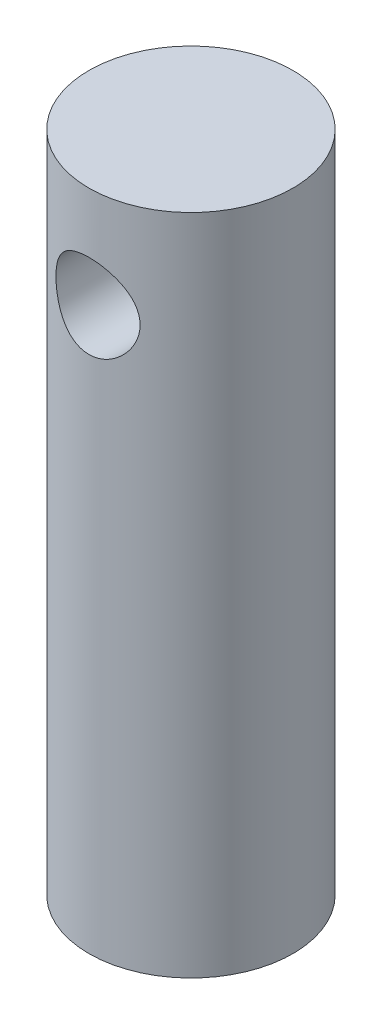
ISO-10303-21;
HEADER;
FILE_DESCRIPTION(('STEP AP214'),'2;1');
FILE_NAME('part.step','',(''),(''),'','','');
FILE_SCHEMA(('AUTOMOTIVE_DESIGN { 1 0 10303 214 1 1 1 1 }'));
ENDSEC;
DATA;
#1=APPLICATION_CONTEXT('core data for automotive mechanical design processes');
#2=APPLICATION_PROTOCOL_DEFINITION('international standard','automotive_design',2000,#1);
#3=PRODUCT_CONTEXT('',#1,'mechanical');
#4=PRODUCT('Part','Part','',(#3));
#5=PRODUCT_RELATED_PRODUCT_CATEGORY('part','',(#4));
#6=PRODUCT_DEFINITION_FORMATION('','',#4);
#7=PRODUCT_DEFINITION_CONTEXT('part definition',#1,'design');
#8=PRODUCT_DEFINITION('design','',#6,#7);
#9=PRODUCT_DEFINITION_SHAPE('','',#8);
#10=(LENGTH_UNIT() NAMED_UNIT(*) SI_UNIT(.MILLI.,.METRE.));
#11=(NAMED_UNIT(*) PLANE_ANGLE_UNIT() SI_UNIT($,.RADIAN.));
#12=(NAMED_UNIT(*) SI_UNIT($,.STERADIAN.) SOLID_ANGLE_UNIT());
#13=UNCERTAINTY_MEASURE_WITH_UNIT(LENGTH_MEASURE(1.E-05),#10,'distance_accuracy_value','');
#14=(GEOMETRIC_REPRESENTATION_CONTEXT(3) GLOBAL_UNCERTAINTY_ASSIGNED_CONTEXT((#13)) GLOBAL_UNIT_ASSIGNED_CONTEXT((#10,
#11,#12)) REPRESENTATION_CONTEXT('',''));
#15=CARTESIAN_POINT('',(0.,0.,0.));
#16=DIRECTION('',(0.,0.,1.));
#17=DIRECTION('',(1.,0.,0.));
#18=AXIS2_PLACEMENT_3D('',#15,#16,#17);
#19=CARTESIAN_POINT('',(0.,26.,0.));
#20=DIRECTION('',(0.,-1.,0.));
#21=DIRECTION('',(0.,0.,-1.));
#22=AXIS2_PLACEMENT_3D('',#19,#20,#21);
#23=CYLINDRICAL_SURFACE('',#22,4.);
#24=CARTESIAN_POINT('',(0.,23.65,-4.));
#25=CARTESIAN_POINT('',(-0.088459678363279,23.6499907827934,-3.99999309817074));
#26=CARTESIAN_POINT('',(-0.177062252057583,23.6428439856567,-3.99703145792172));
#27=CARTESIAN_POINT('',(-0.351759669836409,23.6145088580631,-3.9854711320255));
#28=CARTESIAN_POINT('',(-0.437847271996961,23.5932834889757,-3.97685757767606));
#29=CARTESIAN_POINT('',(-0.604702496902741,23.5377051877981,-3.95491965529936));
#30=CARTESIAN_POINT('',(-0.685486934491195,23.5033963566465,-3.94161112398211));
#31=CARTESIAN_POINT('',(-0.840076633223486,23.4228052421506,-3.91158286286531));
#32=CARTESIAN_POINT('',(-0.913884076117565,23.3765267188298,-3.89486420463244));
#33=CARTESIAN_POINT('',(-1.05618769598525,23.270893245356,-3.85876900012149));
#34=CARTESIAN_POINT('',(-1.12429373957476,23.211042329751,-3.83930654387258));
#35=CARTESIAN_POINT('',(-1.24983574384757,23.081011160341,-3.80029483347098));
#36=CARTESIAN_POINT('',(-1.30726618926957,23.0108256007882,-3.78074553976622));
#37=CARTESIAN_POINT('',(-1.41254826809049,22.8580317511283,-3.74272551686067));
#38=CARTESIAN_POINT('',(-1.45980781790561,22.7749888846935,-3.72435159658093));
#39=CARTESIAN_POINT('',(-1.53951358199407,22.6012636907098,-3.69212136090386));
#40=CARTESIAN_POINT('',(-1.57196727712791,22.510585248637,-3.67826276509115));
#41=CARTESIAN_POINT('',(-1.61953738222492,22.3286520029982,-3.65756021871623));
#42=CARTESIAN_POINT('',(-1.63540371417154,22.2376289278569,-3.65041449103236));
#43=CARTESIAN_POINT('',(-1.65168918120803,22.0539534926347,-3.64307714795703));
#44=CARTESIAN_POINT('',(-1.65211659474,21.9613020323707,-3.64288180572738));
#45=CARTESIAN_POINT('',(-1.6380778077983,21.7844011133813,-3.64921138579604));
#46=CARTESIAN_POINT('',(-1.62472398487459,21.7000418412508,-3.6552343974104));
#47=CARTESIAN_POINT('',(-1.58536484231198,21.5348897156188,-3.67247532251837));
#48=CARTESIAN_POINT('',(-1.55935715587185,21.4540975323967,-3.68369420783859));
#49=CARTESIAN_POINT('',(-1.49492412942489,21.2963548912414,-3.71031458481431));
#50=CARTESIAN_POINT('',(-1.45624866973017,21.2195212621917,-3.72579923184191));
#51=CARTESIAN_POINT('',(-1.36775445443625,21.07313976754,-3.75918616236907));
#52=CARTESIAN_POINT('',(-1.31793135478159,21.0035947577509,-3.77708938726885));
#53=CARTESIAN_POINT('',(-1.20371911924869,20.8677135922122,-3.81509742396095));
#54=CARTESIAN_POINT('',(-1.13846630094389,20.8021180422967,-3.8352618825369));
#55=CARTESIAN_POINT('',(-0.997682554866219,20.6825553255586,-3.87426910607353));
#56=CARTESIAN_POINT('',(-0.922149319847436,20.6285907761392,-3.8931115728953));
#57=CARTESIAN_POINT('',(-0.760736369737327,20.532765226415,-3.92787932271737));
#58=CARTESIAN_POINT('',(-0.674664094072239,20.4911997168058,-3.94373050716791));
#59=CARTESIAN_POINT('',(-0.49592825355298,20.4233969758911,-3.97016319816605));
#60=CARTESIAN_POINT('',(-0.403268287372388,20.3971514467888,-3.98074755693754));
#61=CARTESIAN_POINT('',(-0.220181304317676,20.3622704963218,-3.99492450637935));
#62=CARTESIAN_POINT('',(-0.129974172308224,20.3526408220641,-3.99891121146315));
#63=CARTESIAN_POINT('',(0.05084744015222,20.3483079562367,-4.00069746426785));
#64=CARTESIAN_POINT('',(0.141461799500564,20.3536005868918,-3.99849874371343));
#65=CARTESIAN_POINT('',(0.315907755487547,20.378245268243,-3.98841747083847));
#66=CARTESIAN_POINT('',(0.399855317526684,20.3969040733401,-3.9808153168881));
#67=CARTESIAN_POINT('',(0.563340473329574,20.4467920963371,-3.96098887803091));
#68=CARTESIAN_POINT('',(0.642877505872145,20.4780229098148,-3.94876400644332));
#69=CARTESIAN_POINT('',(0.798061975964474,20.5531893799809,-3.92039728883464));
#70=CARTESIAN_POINT('',(0.873512656660506,20.5974885617562,-3.90414585630856));
#71=CARTESIAN_POINT('',(1.01617847320907,20.6971339342579,-3.86946768187548));
#72=CARTESIAN_POINT('',(1.0833901834211,20.7524846950898,-3.85104004134398));
#73=CARTESIAN_POINT('',(1.21261994292741,20.877204304812,-3.8124029584454));
#74=CARTESIAN_POINT('',(1.27394364561822,20.9472838240393,-3.79215916493832));
#75=CARTESIAN_POINT('',(1.38414835482505,21.0970712906085,-3.75333928940831));
#76=CARTESIAN_POINT('',(1.43302674162727,21.1767812599425,-3.73476355904109));
#77=CARTESIAN_POINT('',(1.51742282291388,21.3450953705333,-3.70128700339843));
#78=CARTESIAN_POINT('',(1.55275802936534,21.4338019160081,-3.68643724424496));
#79=CARTESIAN_POINT('',(1.60769618165394,21.6167091659782,-3.66281640168181));
#80=CARTESIAN_POINT('',(1.62731175174753,21.7109053964182,-3.65404044124936));
#81=CARTESIAN_POINT('',(1.64901123940268,21.8944302731581,-3.64429559365239));
#82=CARTESIAN_POINT('',(1.65231049364125,21.9835872194579,-3.64278573581523));
#83=CARTESIAN_POINT('',(1.64451485356568,22.1611284707592,-3.64631178238903));
#84=CARTESIAN_POINT('',(1.6334220656173,22.2495128869194,-3.65134672892696));
#85=CARTESIAN_POINT('',(1.59817118006572,22.4189330712577,-3.666904904187));
#86=CARTESIAN_POINT('',(1.57461958437454,22.5001207114221,-3.67717261200251));
#87=CARTESIAN_POINT('',(1.51570599472928,22.6574145224741,-3.70184411206584));
#88=CARTESIAN_POINT('',(1.48034069596893,22.7335192642976,-3.7162490615217));
#89=CARTESIAN_POINT('',(1.39638062253791,22.8834220382414,-3.7486340889516));
#90=CARTESIAN_POINT('',(1.34712443599271,22.9568140710214,-3.76677577854003));
#91=CARTESIAN_POINT('',(1.23771718137823,23.0946716872643,-3.80412864636709));
#92=CARTESIAN_POINT('',(1.17756245772962,23.1591342627744,-3.82334018195056));
#93=CARTESIAN_POINT('',(1.04300738755744,23.2819941387037,-3.86230172013188));
#94=CARTESIAN_POINT('',(0.96790011073018,23.3396392236055,-3.88199359359226));
#95=CARTESIAN_POINT('',(0.808343463182037,23.4415401595387,-3.91832426905579));
#96=CARTESIAN_POINT('',(0.723889843442854,23.4857898863659,-3.9349616732268));
#97=CARTESIAN_POINT('',(0.549414760109631,23.5586637398347,-3.96305691394126));
#98=CARTESIAN_POINT('',(0.459513381649428,23.5875424253585,-3.97459855421812));
#99=CARTESIAN_POINT('',(0.275719229213244,23.6295110847851,-3.99154438775475));
#100=CARTESIAN_POINT('',(0.181839966818032,23.6426506662454,-3.99696786149576));
#101=CARTESIAN_POINT('',(0.0584442952271983,23.64922677033,-3.99968194626838));
#102=CARTESIAN_POINT('',(0.029229948670339,23.6500030456642,-4.00000228058838));
#103=CARTESIAN_POINT('',(0.,23.65,-4.));
#104=B_SPLINE_CURVE_WITH_KNOTS('',3,(#24,#25,#26,#27,#28,#29,#30,#31,#32,#33,#34,#35,#36,#37,
#38,#39,#40,#41,#42,#43,#44,#45,#46,#47,#48,#49,#50,#51,#52,#53,#54,#55,#56,#57,#58,#59,#60,#61,
#62,#63,#64,#65,#66,#67,#68,#69,#70,#71,#72,#73,#74,#75,#76,#77,#78,#79,#80,#81,#82,#83,#84,#85,
#86,#87,#88,#89,#90,#91,#92,#93,#94,#95,#96,#97,#98,#99,#100,#101,#102,#103),.UNSPECIFIED.,.T.,
.F.,(4,2,2,2,2,2,2,2,2,2,2,2,2,2,2,2,2,2,2,2,2,2,2,2,2,2,2,2,2,2,2,2,2,2,2,2,2,2,2,4),(0.,
0.26529709877062,0.53129493790666,0.796403981498879,1.06142984766523,1.33841878994456,
1.61555043582129,1.90598404924538,2.19627075414925,2.47277648539421,2.7491339503796,
3.00480633611684,3.26052656166861,3.52163539301342,3.78284615202015,4.06565185095456,
4.3485211252851,4.63767392136376,4.92666995726768,5.19768149557686,5.46861716672806,
5.72643264660555,5.98428085748385,6.25011488704506,6.51605907418433,6.80064580250403,
7.08529238632159,7.37364985225782,7.66177550895677,7.92807823226725,8.19434198489786,
8.44869772098561,8.70312467109946,8.9726747998471,9.24231550885214,9.53104085816543,
9.81989801073179,10.1038095613048,10.3868238858899,10.4744866574818),.UNSPECIFIED.);
#105=CARTESIAN_POINT('',(0.,23.65,-4.));
#106=VERTEX_POINT('',#105);
#107=EDGE_CURVE('E10',#106,#106,#104,.T.);
#108=ORIENTED_EDGE('',*,*,#107,.T.);
#109=EDGE_LOOP('',(#108));
#110=FACE_BOUND('',#109,.T.);
#111=CARTESIAN_POINT('',(1.65,22.,3.64383040220041));
#112=CARTESIAN_POINT('',(1.64999056813102,21.9119035197743,3.64383945275153));
#113=CARTESIAN_POINT('',(1.64289989177358,21.8236595680264,3.64707173267573));
#114=CARTESIAN_POINT('',(1.61480845546373,21.6497129389211,3.65959209124688));
#115=CARTESIAN_POINT('',(1.5937695789634,21.5640178994024,3.66889676295874));
#116=CARTESIAN_POINT('',(1.53873536249638,21.3979970618694,3.69231325052126));
#117=CARTESIAN_POINT('',(1.50479212400174,21.3176511797814,3.70640571161012));
#118=CARTESIAN_POINT('',(1.42506535594207,21.1638182331658,3.73778230052357));
#119=CARTESIAN_POINT('',(1.37928479159595,21.090329457216,3.75506562873473));
#120=CARTESIAN_POINT('',(1.27419856290371,20.9477713121535,3.7920553041855));
#121=CARTESIAN_POINT('',(1.2142851824136,20.8791707442198,3.81184277704779));
#122=CARTESIAN_POINT('',(1.08391072165483,20.7526452280912,3.85094363418238));
#123=CARTESIAN_POINT('',(1.01344563996364,20.6947243485278,3.87025683535296));
#124=CARTESIAN_POINT('',(0.860301943593382,20.5888286286981,3.90721575035942));
#125=CARTESIAN_POINT('',(0.77723239011359,20.5413790672938,3.92475616703248));
#126=CARTESIAN_POINT('',(0.603436361875856,20.4613298546783,3.95520283117798));
#127=CARTESIAN_POINT('',(0.512713242513043,20.4287237356534,3.96811109652272));
#128=CARTESIAN_POINT('',(0.331105172304396,20.3809792933438,3.98726403378776));
#129=CARTESIAN_POINT('',(0.24046562518449,20.3650331520768,3.99381564337609));
#130=CARTESIAN_POINT('',(0.0575763551498627,20.3484533481448,4.0006306156112));
#131=CARTESIAN_POINT('',(-0.0346727137709576,20.347813604678,4.00089647540932));
#132=CARTESIAN_POINT('',(-0.212297380895988,20.3614364961366,3.99529224160632));
#133=CARTESIAN_POINT('',(-0.297754665400399,20.3748121837171,3.98978733384658));
#134=CARTESIAN_POINT('',(-0.465085845235281,20.4145688174478,3.97375926025944));
#135=CARTESIAN_POINT('',(-0.546959476205494,20.4409507212907,3.96323572489496));
#136=CARTESIAN_POINT('',(-0.706295606817232,20.5062876617202,3.93798907731603));
#137=CARTESIAN_POINT('',(-0.783671979762472,20.5454279899249,3.92320447216362));
#138=CARTESIAN_POINT('',(-0.930960489992469,20.6349912791866,3.89088763760773));
#139=CARTESIAN_POINT('',(-1.00086999453932,20.6854182005033,3.87335444442336));
#140=CARTESIAN_POINT('',(-1.13638530947041,20.8001882390286,3.83587133640027));
#141=CARTESIAN_POINT('',(-1.20135746318645,20.8652534108987,3.8158381454309));
#142=CARTESIAN_POINT('',(-1.31973838423494,21.0054096663216,3.77653142784555));
#143=CARTESIAN_POINT('',(-1.37314286572202,21.0805044492633,3.75725818494773));
#144=CARTESIAN_POINT('',(-1.46845339844828,21.2415984035473,3.72106607156909));
#145=CARTESIAN_POINT('',(-1.50994179309277,21.3278675716927,3.70424107982558));
#146=CARTESIAN_POINT('',(-1.57754508127096,21.5070466714059,3.67596385006485));
#147=CARTESIAN_POINT('',(-1.60367071206121,21.5999519138738,3.66450786071417));
#148=CARTESIAN_POINT('',(-1.63821320355942,21.783422895185,3.64919091711418));
#149=CARTESIAN_POINT('',(-1.64765569454682,21.8737583011829,3.64489111171831));
#150=CARTESIAN_POINT('',(-1.65157101672826,22.0548056296986,3.64311980380967));
#151=CARTESIAN_POINT('',(-1.64604885780402,22.1455174160593,3.64564601607449));
#152=CARTESIAN_POINT('',(-1.62112710501826,22.3188010090495,3.65678944366161));
#153=CARTESIAN_POINT('',(-1.60261202118543,22.4015281796746,3.66501803861664));
#154=CARTESIAN_POINT('',(-1.55339580262015,22.56263706438,3.68614612916707));
#155=CARTESIAN_POINT('',(-1.52269185697123,22.6410177713517,3.69904670212356));
#156=CARTESIAN_POINT('',(-1.44853902204985,22.7948790056956,3.72872477858182));
#157=CARTESIAN_POINT('',(-1.40460979308264,22.8701001947792,3.74564214050945));
#158=CARTESIAN_POINT('',(-1.30573455409451,23.0124601694297,3.78124523189864));
#159=CARTESIAN_POINT('',(-1.25078384473683,23.0795954877351,3.79993171387674));
#160=CARTESIAN_POINT('',(-1.12627542162098,23.2094296264467,3.83876011670653));
#161=CARTESIAN_POINT('',(-1.05590387126704,23.2713517370487,3.85889967217623));
#162=CARTESIAN_POINT('',(-0.905297980080101,23.3826428556621,3.89698114804694));
#163=CARTESIAN_POINT('',(-0.825063002026901,23.4320110520032,3.91492292631237));
#164=CARTESIAN_POINT('',(-0.656516816883265,23.5167041342068,3.94668767391886));
#165=CARTESIAN_POINT('',(-0.568191273870489,23.5520034750027,3.96050313975064));
#166=CARTESIAN_POINT('',(-0.386140833605176,23.6069916568587,3.98237104121021));
#167=CARTESIAN_POINT('',(-0.29241911281756,23.6266895829389,3.9904268305481));
#168=CARTESIAN_POINT('',(-0.109187189544836,23.6487882289205,3.9994889299446));
#169=CARTESIAN_POINT('',(-0.0198303081186355,23.6522848287419,4.00094173424749));
#170=CARTESIAN_POINT('',(0.158161739195412,23.6448145656297,3.99786220239438));
#171=CARTESIAN_POINT('',(0.24679702464848,23.6338501500045,3.99333087896147));
#172=CARTESIAN_POINT('',(0.417705375935877,23.5985553578644,3.979024148364));
#173=CARTESIAN_POINT('',(0.500092371627852,23.5746955578854,3.96943363922013));
#174=CARTESIAN_POINT('',(0.65966735573416,23.51479588512,3.94605480923816));
#175=CARTESIAN_POINT('',(0.736854343148745,23.4787536752133,3.93226568297162));
#176=CARTESIAN_POINT('',(0.88766113373262,23.3936954733136,3.90105808483759));
#177=CARTESIAN_POINT('',(0.96096421436115,23.3441687432271,3.88350423911689));
#178=CARTESIAN_POINT('',(1.09852932170705,23.23429715321,3.84685709666619));
#179=CARTESIAN_POINT('',(1.1627880603165,23.1739483769192,3.82776324400832));
#180=CARTESIAN_POINT('',(1.28487769945047,23.0394124726453,3.78859741195738));
#181=CARTESIAN_POINT('',(1.34199767947157,22.9645722431151,3.76854475207571));
#182=CARTESIAN_POINT('',(1.4429647467733,22.8057340243189,3.73105419200534));
#183=CARTESIAN_POINT('',(1.48680449811904,22.7217310082904,3.7136177396712));
#184=CARTESIAN_POINT('',(1.55944447766652,22.5472715587301,3.68370387904713));
#185=CARTESIAN_POINT('',(1.58834112875234,22.4568608919089,3.67119480418033));
#186=CARTESIAN_POINT('',(1.63017263567573,22.2719528559216,3.65281837075147));
#187=CARTESIAN_POINT('',(1.64316103312974,22.1774703091231,3.64692873900432));
#188=CARTESIAN_POINT('',(1.6493120932942,22.0551366863574,3.64414054419779));
#189=CARTESIAN_POINT('',(1.6500029523216,22.027575567715,3.64382756923723));
#190=CARTESIAN_POINT('',(1.65,22.,3.64383040220041));
#191=B_SPLINE_CURVE_WITH_KNOTS('',3,(#111,#112,#113,#114,#115,#116,#117,#118,#119,#120,#121,
#122,#123,#124,#125,#126,#127,#128,#129,#130,#131,#132,#133,#134,#135,#136,#137,#138,#139,#140,
#141,#142,#143,#144,#145,#146,#147,#148,#149,#150,#151,#152,#153,#154,#155,#156,#157,#158,#159,
#160,#161,#162,#163,#164,#165,#166,#167,#168,#169,#170,#171,#172,#173,#174,#175,#176,#177,#178,
#179,#180,#181,#182,#183,#184,#185,#186,#187,#188,#189,#190),.UNSPECIFIED.,.T.,.F.,(4,2,2,2,2,2,
2,2,2,2,2,2,2,2,2,2,2,2,2,2,2,2,2,2,2,2,2,2,2,2,2,2,2,2,2,2,2,2,2,4),(0.,0.264211724660747,
0.529148459018599,0.79302667787205,1.05683885985756,1.33523297260792,1.61373292676209,
1.90403076094908,2.19420198072699,2.4695381624427,2.74476495901024,3.00356896819766,
3.26239203686791,3.5251552692474,3.78801084539546,4.06907613148065,4.35024537535725,
4.64031806272423,4.9301877724111,5.20152035698263,5.47276211576043,5.72713321026166,
5.9815630002888,6.24665916965708,6.51186861189124,6.79815687284347,7.08446363898864,
7.37128791456171,7.65794504349151,7.92489841526079,8.19180661499935,8.44957452423759,
8.70739191275388,8.97680852354695,9.24632283025307,9.53374725602175,9.82133016535516,
10.1070334851925,10.3917725616094,10.4744749384332),.UNSPECIFIED.);
#192=CARTESIAN_POINT('',(1.65,22.,3.64383040220041));
#193=VERTEX_POINT('',#192);
#194=EDGE_CURVE('E55',#193,#193,#191,.T.);
#195=ORIENTED_EDGE('',*,*,#194,.T.);
#196=EDGE_LOOP('',(#195));
#197=FACE_BOUND('',#196,.T.);
#198=CARTESIAN_POINT('',(0.,26.,0.));
#199=DIRECTION('',(0.,1.,0.));
#200=DIRECTION('',(0.,0.,1.));
#201=AXIS2_PLACEMENT_3D('',#198,#199,#200);
#202=CIRCLE('',#201,4.);
#203=CARTESIAN_POINT('',(0.,26.,4.));
#204=VERTEX_POINT('',#203);
#205=EDGE_CURVE('E60',#204,#204,#202,.T.);
#206=ORIENTED_EDGE('',*,*,#205,.F.);
#207=EDGE_LOOP('',(#206));
#208=FACE_BOUND('',#207,.T.);
#209=CARTESIAN_POINT('',(0.,0.,0.));
#210=DIRECTION('',(0.,1.,0.));
#211=DIRECTION('',(0.,0.,1.));
#212=AXIS2_PLACEMENT_3D('',#209,#210,#211);
#213=CIRCLE('',#212,4.);
#214=CARTESIAN_POINT('',(0.,0.,4.));
#215=VERTEX_POINT('',#214);
#216=EDGE_CURVE('E65',#215,#215,#213,.T.);
#217=ORIENTED_EDGE('',*,*,#216,.T.);
#218=EDGE_LOOP('',(#217));
#219=FACE_BOUND('',#218,.T.);
#220=ADVANCED_FACE('F43',(#110,#197,#208,#219),#23,.T.);
#221=CARTESIAN_POINT('',(0.,26.,0.));
#222=DIRECTION('',(0.,1.,0.));
#223=DIRECTION('',(0.,0.,1.));
#224=AXIS2_PLACEMENT_3D('',#221,#222,#223);
#225=PLANE('',#224);
#226=ORIENTED_EDGE('',*,*,#205,.T.);
#227=EDGE_LOOP('',(#226));
#228=FACE_BOUND('',#227,.T.);
#229=ADVANCED_FACE('F77',(#228),#225,.T.);
#230=CARTESIAN_POINT('',(0.,0.,0.));
#231=DIRECTION('',(0.,1.,0.));
#232=DIRECTION('',(0.,0.,1.));
#233=AXIS2_PLACEMENT_3D('',#230,#231,#232);
#234=PLANE('',#233);
#235=ORIENTED_EDGE('',*,*,#216,.F.);
#236=EDGE_LOOP('',(#235));
#237=FACE_BOUND('',#236,.T.);
#238=ADVANCED_FACE('F75',(#237),#234,.F.);
#239=CARTESIAN_POINT('',(0.,22.,-4.));
#240=DIRECTION('',(0.,0.,1.));
#241=DIRECTION('',(1.,0.,0.));
#242=AXIS2_PLACEMENT_3D('',#239,#240,#241);
#243=CYLINDRICAL_SURFACE('',#242,1.65);
#244=ORIENTED_EDGE('',*,*,#194,.F.);
#245=EDGE_LOOP('',(#244));
#246=FACE_BOUND('',#245,.T.);
#247=ORIENTED_EDGE('',*,*,#107,.F.);
#248=EDGE_LOOP('',(#247));
#249=FACE_BOUND('',#248,.T.);
#250=ADVANCED_FACE('F71',(#246,#249),#243,.F.);
#251=CLOSED_SHELL('',(#220,#229,#238,#250));
#252=MANIFOLD_SOLID_BREP('B2',#251);
#253=ADVANCED_BREP_SHAPE_REPRESENTATION('',(#18,#252),#14);
#254=SHAPE_DEFINITION_REPRESENTATION(#9,#253);
ENDSEC;
END-ISO-10303-21;
